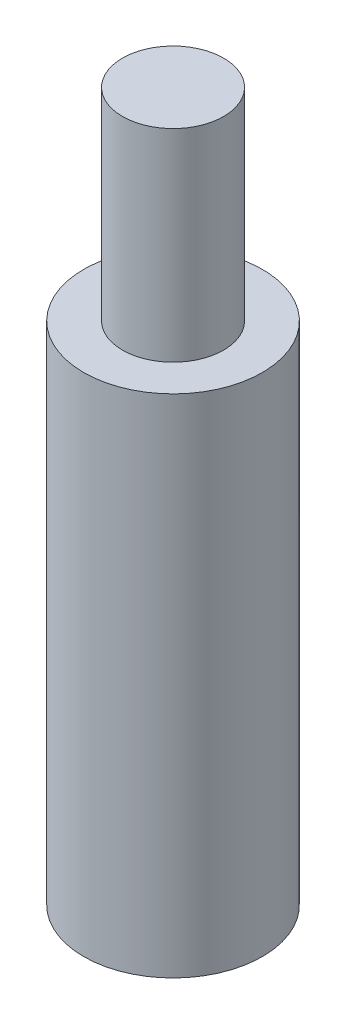
ISO-10303-21;
HEADER;
FILE_DESCRIPTION(('STEP AP214'),'2;1');
FILE_NAME('part.step','',(''),(''),'','','');
FILE_SCHEMA(('AUTOMOTIVE_DESIGN { 1 0 10303 214 1 1 1 1 }'));
ENDSEC;
DATA;
#1=APPLICATION_CONTEXT('core data for automotive mechanical design processes');
#2=APPLICATION_PROTOCOL_DEFINITION('international standard','automotive_design',2000,#1);
#3=PRODUCT_CONTEXT('',#1,'mechanical');
#4=PRODUCT('Part','Part','',(#3));
#5=PRODUCT_RELATED_PRODUCT_CATEGORY('part','',(#4));
#6=PRODUCT_DEFINITION_FORMATION('','',#4);
#7=PRODUCT_DEFINITION_CONTEXT('part definition',#1,'design');
#8=PRODUCT_DEFINITION('design','',#6,#7);
#9=PRODUCT_DEFINITION_SHAPE('','',#8);
#10=(LENGTH_UNIT() NAMED_UNIT(*) SI_UNIT(.MILLI.,.METRE.));
#11=(NAMED_UNIT(*) PLANE_ANGLE_UNIT() SI_UNIT($,.RADIAN.));
#12=(NAMED_UNIT(*) SI_UNIT($,.STERADIAN.) SOLID_ANGLE_UNIT());
#13=UNCERTAINTY_MEASURE_WITH_UNIT(LENGTH_MEASURE(1.E-05),#10,'distance_accuracy_value','');
#14=(GEOMETRIC_REPRESENTATION_CONTEXT(3) GLOBAL_UNCERTAINTY_ASSIGNED_CONTEXT((#13)) GLOBAL_UNIT_ASSIGNED_CONTEXT((#10,
#11,#12)) REPRESENTATION_CONTEXT('',''));
#15=CARTESIAN_POINT('',(0.,0.,0.));
#16=DIRECTION('',(0.,0.,1.));
#17=DIRECTION('',(1.,0.,0.));
#18=AXIS2_PLACEMENT_3D('',#15,#16,#17);
#19=CARTESIAN_POINT('',(0.,15.,0.));
#20=DIRECTION('',(0.,1.,0.));
#21=DIRECTION('',(0.,0.,1.));
#22=AXIS2_PLACEMENT_3D('',#19,#20,#21);
#23=PLANE('',#22);
#24=CARTESIAN_POINT('',(0.,15.,0.));
#25=DIRECTION('',(0.,1.,0.));
#26=DIRECTION('',(0.,0.,1.));
#27=AXIS2_PLACEMENT_3D('',#24,#25,#26);
#28=CIRCLE('',#27,2.65);
#29=CARTESIAN_POINT('',(0.,15.,2.65));
#30=VERTEX_POINT('',#29);
#31=EDGE_CURVE('E10',#30,#30,#28,.T.);
#32=ORIENTED_EDGE('',*,*,#31,.T.);
#33=EDGE_LOOP('',(#32));
#34=FACE_BOUND('',#33,.T.);
#35=CARTESIAN_POINT('',(0.,15.,0.));
#36=DIRECTION('',(0.,1.,0.));
#37=DIRECTION('',(0.,0.,1.));
#38=AXIS2_PLACEMENT_3D('',#35,#36,#37);
#39=CIRCLE('',#38,1.5);
#40=CARTESIAN_POINT('',(0.,15.,1.5));
#41=VERTEX_POINT('',#40);
#42=EDGE_CURVE('E47',#41,#41,#39,.T.);
#43=ORIENTED_EDGE('',*,*,#42,.F.);
#44=EDGE_LOOP('',(#43));
#45=FACE_BOUND('',#44,.T.);
#46=ADVANCED_FACE('F34',(#34,#45),#23,.T.);
#47=CARTESIAN_POINT('',(0.,15.,0.));
#48=DIRECTION('',(0.,-1.,0.));
#49=DIRECTION('',(0.,0.,-1.));
#50=AXIS2_PLACEMENT_3D('',#47,#48,#49);
#51=CYLINDRICAL_SURFACE('',#50,2.65);
#52=ORIENTED_EDGE('',*,*,#31,.F.);
#53=EDGE_LOOP('',(#52));
#54=FACE_BOUND('',#53,.T.);
#55=CARTESIAN_POINT('',(0.,0.,0.));
#56=DIRECTION('',(0.,1.,0.));
#57=DIRECTION('',(0.,0.,1.));
#58=AXIS2_PLACEMENT_3D('',#55,#56,#57);
#59=CIRCLE('',#58,2.65);
#60=CARTESIAN_POINT('',(0.,0.,2.65));
#61=VERTEX_POINT('',#60);
#62=EDGE_CURVE('E38',#61,#61,#59,.T.);
#63=ORIENTED_EDGE('',*,*,#62,.T.);
#64=EDGE_LOOP('',(#63));
#65=FACE_BOUND('',#64,.T.);
#66=ADVANCED_FACE('F36',(#54,#65),#51,.T.);
#67=CARTESIAN_POINT('',(0.,0.,0.));
#68=DIRECTION('',(0.,1.,0.));
#69=DIRECTION('',(0.,0.,1.));
#70=AXIS2_PLACEMENT_3D('',#67,#68,#69);
#71=PLANE('',#70);
#72=CARTESIAN_POINT('',(0.,0.,0.));
#73=DIRECTION('',(0.,-1.,0.));
#74=DIRECTION('',(0.,0.,-1.));
#75=AXIS2_PLACEMENT_3D('',#72,#73,#74);
#76=CIRCLE('',#75,1.5);
#77=CARTESIAN_POINT('',(0.,0.,-1.5));
#78=VERTEX_POINT('',#77);
#79=EDGE_CURVE('E53',#78,#78,#76,.T.);
#80=ORIENTED_EDGE('',*,*,#79,.F.);
#81=EDGE_LOOP('',(#80));
#82=FACE_BOUND('',#81,.T.);
#83=ORIENTED_EDGE('',*,*,#62,.F.);
#84=EDGE_LOOP('',(#83));
#85=FACE_BOUND('',#84,.T.);
#86=ADVANCED_FACE('F68',(#82,#85),#71,.F.);
#87=CARTESIAN_POINT('',(0.,21.,0.));
#88=DIRECTION('',(0.,-1.,0.));
#89=DIRECTION('',(0.,0.,-1.));
#90=AXIS2_PLACEMENT_3D('',#87,#88,#89);
#91=CYLINDRICAL_SURFACE('',#90,1.5);
#92=CARTESIAN_POINT('',(0.,21.,0.));
#93=DIRECTION('',(0.,1.,0.));
#94=DIRECTION('',(0.,0.,1.));
#95=AXIS2_PLACEMENT_3D('',#92,#93,#94);
#96=CIRCLE('',#95,1.5);
#97=CARTESIAN_POINT('',(0.,21.,1.5));
#98=VERTEX_POINT('',#97);
#99=EDGE_CURVE('E45',#98,#98,#96,.T.);
#100=ORIENTED_EDGE('',*,*,#99,.F.);
#101=EDGE_LOOP('',(#100));
#102=FACE_BOUND('',#101,.T.);
#103=ORIENTED_EDGE('',*,*,#42,.T.);
#104=EDGE_LOOP('',(#103));
#105=FACE_BOUND('',#104,.T.);
#106=ADVANCED_FACE('F71',(#102,#105),#91,.T.);
#107=CARTESIAN_POINT('',(0.,21.,0.));
#108=DIRECTION('',(0.,1.,0.));
#109=DIRECTION('',(0.,0.,1.));
#110=AXIS2_PLACEMENT_3D('',#107,#108,#109);
#111=PLANE('',#110);
#112=ORIENTED_EDGE('',*,*,#99,.T.);
#113=EDGE_LOOP('',(#112));
#114=FACE_BOUND('',#113,.T.);
#115=ADVANCED_FACE('F64',(#114),#111,.T.);
#116=CARTESIAN_POINT('',(0.,10.,0.));
#117=DIRECTION('',(0.,-1.,0.));
#118=DIRECTION('',(0.,0.,-1.));
#119=AXIS2_PLACEMENT_3D('',#116,#117,#118);
#120=CYLINDRICAL_SURFACE('',#119,1.5);
#121=CARTESIAN_POINT('',(0.,10.,0.));
#122=DIRECTION('',(0.,-1.,0.));
#123=DIRECTION('',(0.,0.,-1.));
#124=AXIS2_PLACEMENT_3D('',#121,#122,#123);
#125=CIRCLE('',#124,1.5);
#126=CARTESIAN_POINT('',(0.,10.,-1.5));
#127=VERTEX_POINT('',#126);
#128=EDGE_CURVE('E50',#127,#127,#125,.T.);
#129=ORIENTED_EDGE('',*,*,#128,.F.);
#130=EDGE_LOOP('',(#129));
#131=FACE_BOUND('',#130,.T.);
#132=ORIENTED_EDGE('',*,*,#79,.T.);
#133=EDGE_LOOP('',(#132));
#134=FACE_BOUND('',#133,.T.);
#135=ADVANCED_FACE('F61',(#131,#134),#120,.F.);
#136=CARTESIAN_POINT('',(0.,10.,0.));
#137=DIRECTION('',(0.,-1.,0.));
#138=DIRECTION('',(0.,0.,-1.));
#139=AXIS2_PLACEMENT_3D('',#136,#137,#138);
#140=PLANE('',#139);
#141=ORIENTED_EDGE('',*,*,#128,.T.);
#142=EDGE_LOOP('',(#141));
#143=FACE_BOUND('',#142,.T.);
#144=ADVANCED_FACE('F59',(#143),#140,.T.);
#145=CLOSED_SHELL('',(#46,#66,#86,#106,#115,#135,#144));
#146=MANIFOLD_SOLID_BREP('B2',#145);
#147=ADVANCED_BREP_SHAPE_REPRESENTATION('',(#18,#146),#14);
#148=SHAPE_DEFINITION_REPRESENTATION(#9,#147);
ENDSEC;
END-ISO-10303-21;
